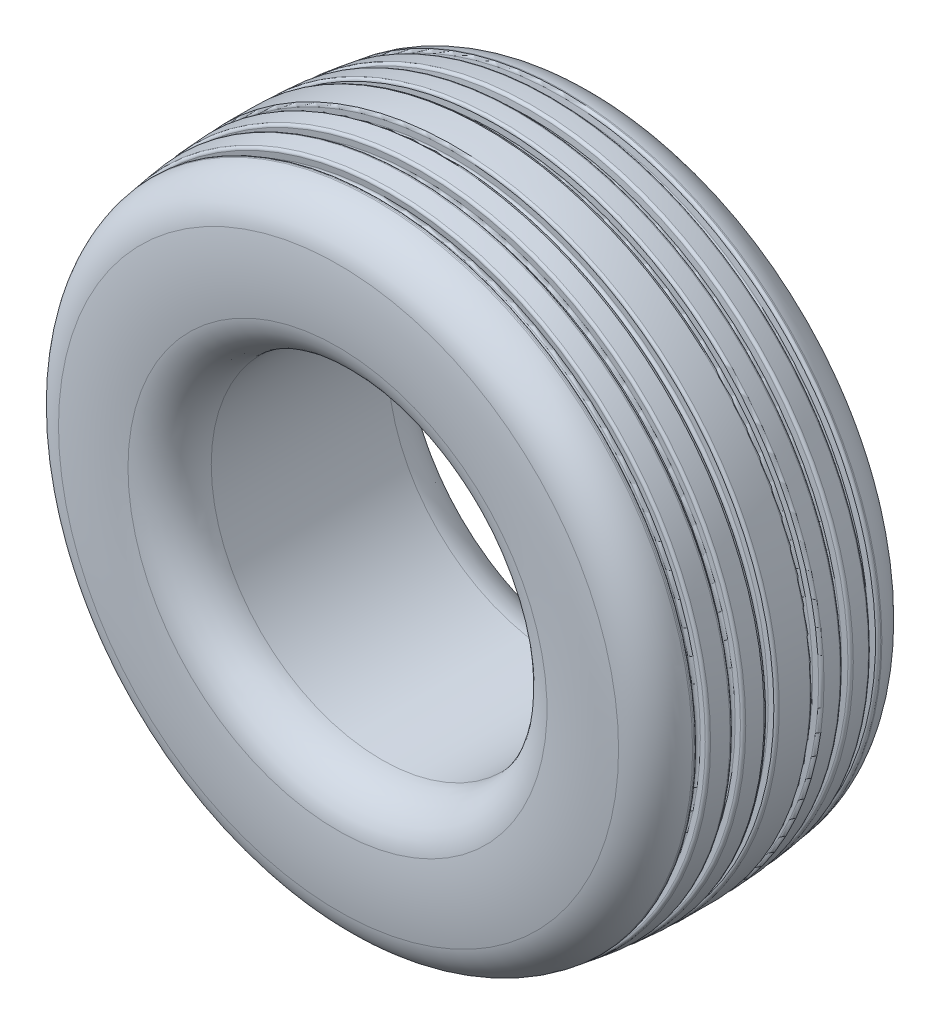
ISO-10303-21;
HEADER;
FILE_DESCRIPTION(('STEP AP214'),'2;1');
FILE_NAME('part.step','',(''),(''),'','','');
FILE_SCHEMA(('AUTOMOTIVE_DESIGN { 1 0 10303 214 1 1 1 1 }'));
ENDSEC;
DATA;
#1=APPLICATION_CONTEXT('core data for automotive mechanical design processes');
#2=APPLICATION_PROTOCOL_DEFINITION('international standard','automotive_design',2000,#1);
#3=PRODUCT_CONTEXT('',#1,'mechanical');
#4=PRODUCT('Part','Part','',(#3));
#5=PRODUCT_RELATED_PRODUCT_CATEGORY('part','',(#4));
#6=PRODUCT_DEFINITION_FORMATION('','',#4);
#7=PRODUCT_DEFINITION_CONTEXT('part definition',#1,'design');
#8=PRODUCT_DEFINITION('design','',#6,#7);
#9=PRODUCT_DEFINITION_SHAPE('','',#8);
#10=(LENGTH_UNIT() NAMED_UNIT(*) SI_UNIT(.MILLI.,.METRE.));
#11=(NAMED_UNIT(*) PLANE_ANGLE_UNIT() SI_UNIT($,.RADIAN.));
#12=(NAMED_UNIT(*) SI_UNIT($,.STERADIAN.) SOLID_ANGLE_UNIT());
#13=UNCERTAINTY_MEASURE_WITH_UNIT(LENGTH_MEASURE(1.E-05),#10,'distance_accuracy_value','');
#14=(GEOMETRIC_REPRESENTATION_CONTEXT(3) GLOBAL_UNCERTAINTY_ASSIGNED_CONTEXT((#13)) GLOBAL_UNIT_ASSIGNED_CONTEXT((#10,
#11,#12)) REPRESENTATION_CONTEXT('',''));
#15=CARTESIAN_POINT('',(0.,0.,0.));
#16=DIRECTION('',(0.,0.,1.));
#17=DIRECTION('',(1.,0.,0.));
#18=AXIS2_PLACEMENT_3D('',#15,#16,#17);
#19=CARTESIAN_POINT('',(0.,0.,-2.22044604925031E-13));
#20=DIRECTION('',(0.,0.,1.));
#21=DIRECTION('',(1.,0.,0.));
#22=AXIS2_PLACEMENT_3D('',#19,#20,#21);
#23=DEGENERATE_TOROIDAL_SURFACE('',#22,591.666666666668,1321.66666666667,.F.);
#24=CARTESIAN_POINT('',(0.,0.,-34.7462902611341));
#25=DIRECTION('',(0.,0.,1.));
#26=DIRECTION('',(1.,0.,0.));
#27=AXIS2_PLACEMENT_3D('',#24,#25,#26);
#28=CIRCLE('',#27,729.543185359447);
#29=CARTESIAN_POINT('',(729.543185359447,0.,-34.7462902611341));
#30=VERTEX_POINT('',#29);
#31=EDGE_CURVE('E139',#30,#30,#28,.T.);
#32=ORIENTED_EDGE('',*,*,#31,.T.);
#33=EDGE_LOOP('',(#32));
#34=FACE_BOUND('',#33,.T.);
#35=CARTESIAN_POINT('',(0.,0.,34.7462902611341));
#36=DIRECTION('',(0.,0.,-1.));
#37=DIRECTION('',(-1.,0.,0.));
#38=AXIS2_PLACEMENT_3D('',#35,#36,#37);
#39=CIRCLE('',#38,729.543185359447);
#40=CARTESIAN_POINT('',(-729.543185359447,0.,34.7462902611341));
#41=VERTEX_POINT('',#40);
#42=EDGE_CURVE('E205',#41,#41,#39,.T.);
#43=ORIENTED_EDGE('',*,*,#42,.T.);
#44=EDGE_LOOP('',(#43));
#45=FACE_BOUND('',#44,.T.);
#46=ADVANCED_FACE('F38',(#34,#45),#23,.F.);
#47=CARTESIAN_POINT('',(0.,0.,-212.651269505067));
#48=DIRECTION('',(0.,0.,1.));
#49=DIRECTION('',(1.,0.,0.));
#50=AXIS2_PLACEMENT_3D('',#47,#48,#49);
#51=CIRCLE('',#50,712.780425152569);
#52=CARTESIAN_POINT('',(712.780425152569,0.,-212.651269505067));
#53=VERTEX_POINT('',#52);
#54=EDGE_CURVE('E10',#53,#53,#51,.T.);
#55=ORIENTED_EDGE('',*,*,#54,.T.);
#56=EDGE_LOOP('',(#55));
#57=FACE_BOUND('',#56,.T.);
#58=CARTESIAN_POINT('',(0.,0.,-209.80915531276));
#59=DIRECTION('',(0.,0.,1.));
#60=DIRECTION('',(1.,0.,0.));
#61=AXIS2_PLACEMENT_3D('',#58,#59,#60);
#62=CIRCLE('',#61,713.24056993091);
#63=CARTESIAN_POINT('',(713.24056993091,0.,-209.80915531276));
#64=VERTEX_POINT('',#63);
#65=EDGE_CURVE('E70',#64,#64,#62,.F.);
#66=ORIENTED_EDGE('',*,*,#65,.T.);
#67=EDGE_LOOP('',(#66));
#68=FACE_BOUND('',#67,.T.);
#69=ADVANCED_FACE('F255',(#57,#68),#23,.F.);
#70=CARTESIAN_POINT('',(0.,0.,212.651269505067));
#71=DIRECTION('',(0.,0.,-1.));
#72=DIRECTION('',(-1.,0.,0.));
#73=AXIS2_PLACEMENT_3D('',#70,#71,#72);
#74=CIRCLE('',#73,712.780425152569);
#75=CARTESIAN_POINT('',(-712.780425152569,0.,212.651269505067));
#76=VERTEX_POINT('',#75);
#77=EDGE_CURVE('E61',#76,#76,#74,.T.);
#78=ORIENTED_EDGE('',*,*,#77,.T.);
#79=EDGE_LOOP('',(#78));
#80=FACE_BOUND('',#79,.T.);
#81=CARTESIAN_POINT('',(0.,0.,209.809155312761));
#82=DIRECTION('',(0.,0.,-1.));
#83=DIRECTION('',(-1.,0.,0.));
#84=AXIS2_PLACEMENT_3D('',#81,#82,#83);
#85=CIRCLE('',#84,713.24056993091);
#86=CARTESIAN_POINT('',(-713.24056993091,0.,209.809155312761));
#87=VERTEX_POINT('',#86);
#88=EDGE_CURVE('E142',#87,#87,#85,.F.);
#89=ORIENTED_EDGE('',*,*,#88,.T.);
#90=EDGE_LOOP('',(#89));
#91=FACE_BOUND('',#90,.T.);
#92=ADVANCED_FACE('F302',(#80,#91),#23,.F.);
#93=CARTESIAN_POINT('',(0.,0.,-277.914186143353));
#94=DIRECTION('',(0.,0.,1.));
#95=DIRECTION('',(1.,0.,0.));
#96=AXIS2_PLACEMENT_3D('',#93,#94,#95);
#97=DEGENERATE_TOROIDAL_SURFACE('',#96,541.47,580.,.T.);
#98=CARTESIAN_POINT('',(0.,0.,295.410770488003));
#99=DIRECTION('',(0.,0.,-1.));
#100=DIRECTION('',(-1.,0.,0.));
#101=AXIS2_PLACEMENT_3D('',#98,#99,#100);
#102=CIRCLE('',#101,629.211062813586);
#103=CARTESIAN_POINT('',(-629.211062813586,0.,295.410770488003));
#104=VERTEX_POINT('',#103);
#105=EDGE_CURVE('E64',#104,#104,#102,.F.);
#106=ORIENTED_EDGE('',*,*,#105,.T.);
#107=EDGE_LOOP('',(#106));
#108=FACE_BOUND('',#107,.T.);
#109=CARTESIAN_POINT('',(0.,0.,297.757726655887));
#110=DIRECTION('',(0.,0.,-1.));
#111=DIRECTION('',(-1.,0.,0.));
#112=AXIS2_PLACEMENT_3D('',#109,#110,#111);
#113=CIRCLE('',#112,470.74625);
#114=CARTESIAN_POINT('',(-470.74625,0.,297.757726655887));
#115=VERTEX_POINT('',#114);
#116=EDGE_CURVE('E67',#115,#115,#113,.T.);
#117=ORIENTED_EDGE('',*,*,#116,.T.);
#118=EDGE_LOOP('',(#117));
#119=FACE_BOUND('',#118,.T.);
#120=ADVANCED_FACE('F348',(#108,#119),#97,.T.);
#121=CARTESIAN_POINT('',(0.,0.,600.));
#122=DIRECTION('',(0.,0.,1.));
#123=DIRECTION('',(1.,0.,0.));
#124=AXIS2_PLACEMENT_3D('',#121,#122,#123);
#125=CYLINDRICAL_SURFACE('',#124,382.94);
#126=CARTESIAN_POINT('',(0.,0.,198.503948587054));
#127=DIRECTION('',(0.,0.,-1.));
#128=DIRECTION('',(-1.,0.,0.));
#129=AXIS2_PLACEMENT_3D('',#126,#127,#128);
#130=CIRCLE('',#129,382.94);
#131=CARTESIAN_POINT('',(-382.94,0.,198.503948587054));
#132=VERTEX_POINT('',#131);
#133=EDGE_CURVE('E53',#132,#132,#130,.F.);
#134=ORIENTED_EDGE('',*,*,#133,.T.);
#135=EDGE_LOOP('',(#134));
#136=FACE_BOUND('',#135,.T.);
#137=CARTESIAN_POINT('',(0.,0.,-198.503948587054));
#138=DIRECTION('',(0.,0.,-1.));
#139=DIRECTION('',(-1.,0.,0.));
#140=AXIS2_PLACEMENT_3D('',#137,#138,#139);
#141=CIRCLE('',#140,382.94);
#142=CARTESIAN_POINT('',(-382.94,0.,-198.503948587054));
#143=VERTEX_POINT('',#142);
#144=EDGE_CURVE('E58',#143,#143,#141,.T.);
#145=ORIENTED_EDGE('',*,*,#144,.T.);
#146=EDGE_LOOP('',(#145));
#147=FACE_BOUND('',#146,.T.);
#148=ADVANCED_FACE('F354',(#136,#147),#125,.F.);
#149=CARTESIAN_POINT('',(0.,0.,277.914186143353));
#150=DIRECTION('',(0.,0.,1.));
#151=DIRECTION('',(1.,0.,0.));
#152=AXIS2_PLACEMENT_3D('',#149,#150,#151);
#153=DEGENERATE_TOROIDAL_SURFACE('',#152,541.47,580.,.T.);
#154=CARTESIAN_POINT('',(0.,0.,-297.757726655887));
#155=DIRECTION('',(0.,0.,1.));
#156=DIRECTION('',(1.,0.,0.));
#157=AXIS2_PLACEMENT_3D('',#154,#155,#156);
#158=CIRCLE('',#157,470.74625);
#159=CARTESIAN_POINT('',(470.74625,0.,-297.757726655887));
#160=VERTEX_POINT('',#159);
#161=EDGE_CURVE('E45',#160,#160,#158,.T.);
#162=ORIENTED_EDGE('',*,*,#161,.T.);
#163=EDGE_LOOP('',(#162));
#164=FACE_BOUND('',#163,.T.);
#165=CARTESIAN_POINT('',(0.,0.,-295.410770488002));
#166=DIRECTION('',(0.,0.,1.));
#167=DIRECTION('',(1.,0.,0.));
#168=AXIS2_PLACEMENT_3D('',#165,#166,#167);
#169=CIRCLE('',#168,629.211062813586);
#170=CARTESIAN_POINT('',(629.211062813586,0.,-295.410770488002));
#171=VERTEX_POINT('',#170);
#172=EDGE_CURVE('E49',#171,#171,#169,.F.);
#173=ORIENTED_EDGE('',*,*,#172,.T.);
#174=EDGE_LOOP('',(#173));
#175=FACE_BOUND('',#174,.T.);
#176=ADVANCED_FACE('F326',(#164,#175),#153,.T.);
#177=CARTESIAN_POINT('',(0.,0.,-2.22044604925031E-13));
#178=DIRECTION('',(0.,0.,1.));
#179=DIRECTION('',(1.,0.,0.));
#180=AXIS2_PLACEMENT_3D('',#177,#178,#179);
#181=DEGENERATE_TOROIDAL_SURFACE('',#180,591.666666666668,1296.66666666667,.F.);
#182=CARTESIAN_POINT('',(0.,0.,185.912630517313));
#183=DIRECTION('',(0.,0.,-1.));
#184=DIRECTION('',(-1.,0.,0.));
#185=AXIS2_PLACEMENT_3D('',#182,#183,#184);
#186=CIRCLE('',#185,691.602961376707);
#187=CARTESIAN_POINT('',(-691.602961376707,0.,185.912630517313));
#188=VERTEX_POINT('',#187);
#189=EDGE_CURVE('E151',#188,#188,#186,.F.);
#190=ORIENTED_EDGE('',*,*,#189,.T.);
#191=EDGE_LOOP('',(#190));
#192=FACE_BOUND('',#191,.T.);
#193=CARTESIAN_POINT('',(0.,0.,194.09698450321));
#194=DIRECTION('',(0.,0.,-1.));
#195=DIRECTION('',(-1.,0.,0.));
#196=AXIS2_PLACEMENT_3D('',#193,#194,#195);
#197=CIRCLE('',#196,690.390588315031);
#198=CARTESIAN_POINT('',(-690.390588315031,0.,194.09698450321));
#199=VERTEX_POINT('',#198);
#200=EDGE_CURVE('E154',#199,#199,#197,.T.);
#201=ORIENTED_EDGE('',*,*,#200,.T.);
#202=EDGE_LOOP('',(#201));
#203=FACE_BOUND('',#202,.T.);
#204=ADVANCED_FACE('F314',(#192,#203),#181,.F.);
#205=CARTESIAN_POINT('',(0.,0.,180.));
#206=DIRECTION('',(0.,0.,1.));
#207=DIRECTION('',(1.,0.,0.));
#208=AXIS2_PLACEMENT_3D('',#205,#206,#207);
#209=CONICAL_SURFACE('',#208,692.445651023824,1.43152909270516);
#210=CARTESIAN_POINT('',(0.,0.,182.635632923406));
#211=DIRECTION('',(0.,0.,1.));
#212=DIRECTION('',(1.,0.,0.));
#213=AXIS2_PLACEMENT_3D('',#210,#211,#212);
#214=CIRCLE('',#213,711.248143811917);
#215=CARTESIAN_POINT('',(711.248143811917,0.,182.635632923406));
#216=VERTEX_POINT('',#215);
#217=EDGE_CURVE('E157',#216,#216,#214,.T.);
#218=ORIENTED_EDGE('',*,*,#217,.T.);
#219=EDGE_LOOP('',(#218));
#220=FACE_BOUND('',#219,.T.);
#221=CARTESIAN_POINT('',(0.,0.,180.830986720625));
#222=DIRECTION('',(0.,0.,1.));
#223=DIRECTION('',(1.,0.,0.));
#224=AXIS2_PLACEMENT_3D('',#221,#222,#223);
#225=CIRCLE('',#224,698.373874822666);
#226=CARTESIAN_POINT('',(698.373874822666,0.,180.830986720625));
#227=VERTEX_POINT('',#226);
#228=EDGE_CURVE('E160',#227,#227,#225,.F.);
#229=ORIENTED_EDGE('',*,*,#228,.T.);
#230=EDGE_LOOP('',(#229));
#231=FACE_BOUND('',#230,.T.);
#232=ADVANCED_FACE('F311',(#220,#231),#209,.F.);
#233=CARTESIAN_POINT('',(0.,0.,203.856041131105));
#234=DIRECTION('',(0.,0.,1.));
#235=DIRECTION('',(1.,0.,0.));
#236=AXIS2_PLACEMENT_3D('',#233,#234,#235);
#237=CONICAL_SURFACE('',#236,714.183819519302,1.41593645930072);
#238=CARTESIAN_POINT('',(0.,0.,200.923318578472));
#239=DIRECTION('',(0.,0.,1.));
#240=DIRECTION('',(1.,0.,0.));
#241=AXIS2_PLACEMENT_3D('',#238,#239,#240);
#242=CIRCLE('',#241,695.397537052735);
#243=CARTESIAN_POINT('',(695.397537052735,0.,200.923318578472));
#244=VERTEX_POINT('',#243);
#245=EDGE_CURVE('E145',#244,#244,#242,.T.);
#246=ORIENTED_EDGE('',*,*,#245,.T.);
#247=EDGE_LOOP('',(#246));
#248=FACE_BOUND('',#247,.T.);
#249=CARTESIAN_POINT('',(0.,0.,202.928481026007));
#250=DIRECTION('',(0.,0.,1.));
#251=DIRECTION('',(1.,0.,0.));
#252=AXIS2_PLACEMENT_3D('',#249,#250,#251);
#253=CIRCLE('',#252,708.242102965362);
#254=CARTESIAN_POINT('',(708.242102965362,0.,202.928481026007));
#255=VERTEX_POINT('',#254);
#256=EDGE_CURVE('E148',#255,#255,#253,.F.);
#257=ORIENTED_EDGE('',*,*,#256,.T.);
#258=EDGE_LOOP('',(#257));
#259=FACE_BOUND('',#258,.T.);
#260=ADVANCED_FACE('F301',(#248,#259),#237,.T.);
#261=CARTESIAN_POINT('',(0.,0.,138.502042920171));
#262=DIRECTION('',(0.,0.,-1.));
#263=DIRECTION('',(-1.,0.,0.));
#264=AXIS2_PLACEMENT_3D('',#261,#262,#263);
#265=CIRCLE('',#264,722.722911002267);
#266=CARTESIAN_POINT('',(-722.722911002267,0.,138.502042920171));
#267=VERTEX_POINT('',#266);
#268=EDGE_CURVE('E163',#267,#267,#265,.F.);
#269=ORIENTED_EDGE('',*,*,#268,.T.);
#270=EDGE_LOOP('',(#269));
#271=FACE_BOUND('',#270,.T.);
#272=CARTESIAN_POINT('',(0.,0.,177.499523620628));
#273=DIRECTION('',(0.,0.,-1.));
#274=DIRECTION('',(-1.,0.,0.));
#275=AXIS2_PLACEMENT_3D('',#272,#273,#274);
#276=CIRCLE('',#275,718.026693205112);
#277=CARTESIAN_POINT('',(-718.026693205112,0.,177.499523620628));
#278=VERTEX_POINT('',#277);
#279=EDGE_CURVE('E166',#278,#278,#276,.T.);
#280=ORIENTED_EDGE('',*,*,#279,.T.);
#281=EDGE_LOOP('',(#280));
#282=FACE_BOUND('',#281,.T.);
#283=ADVANCED_FACE('F254',(#271,#282),#23,.F.);
#284=CARTESIAN_POINT('',(0.,0.,-2.22044604925031E-13));
#285=DIRECTION('',(0.,0.,1.));
#286=DIRECTION('',(1.,0.,0.));
#287=AXIS2_PLACEMENT_3D('',#284,#285,#286);
#288=DEGENERATE_TOROIDAL_SURFACE('',#287,591.666666666668,1296.66666666667,.F.);
#289=CARTESIAN_POINT('',(0.,0.,115.949668340668));
#290=DIRECTION('',(0.,0.,-1.));
#291=DIRECTION('',(-1.,0.,0.));
#292=AXIS2_PLACEMENT_3D('',#289,#290,#291);
#293=CIRCLE('',#292,699.805407695041);
#294=CARTESIAN_POINT('',(-699.805407695041,0.,115.949668340668));
#295=VERTEX_POINT('',#294);
#296=EDGE_CURVE('E175',#295,#295,#293,.F.);
#297=ORIENTED_EDGE('',*,*,#296,.T.);
#298=EDGE_LOOP('',(#297));
#299=FACE_BOUND('',#298,.T.);
#300=CARTESIAN_POINT('',(0.,0.,124.056348016691));
#301=DIRECTION('',(0.,0.,-1.));
#302=DIRECTION('',(-1.,0.,0.));
#303=AXIS2_PLACEMENT_3D('',#300,#301,#302);
#304=CIRCLE('',#303,699.051918835691);
#305=CARTESIAN_POINT('',(-699.051918835691,0.,124.056348016691));
#306=VERTEX_POINT('',#305);
#307=EDGE_CURVE('E178',#306,#306,#304,.T.);
#308=ORIENTED_EDGE('',*,*,#307,.T.);
#309=EDGE_LOOP('',(#308));
#310=FACE_BOUND('',#309,.T.);
#311=ADVANCED_FACE('F267',(#299,#310),#288,.F.);
#312=CARTESIAN_POINT('',(0.,0.,110.));
#313=DIRECTION('',(0.,0.,1.));
#314=DIRECTION('',(1.,0.,0.));
#315=AXIS2_PLACEMENT_3D('',#312,#313,#314);
#316=CONICAL_SURFACE('',#315,700.325765371712,1.48586133924975);
#317=CARTESIAN_POINT('',(0.,0.,111.610664564305));
#318=DIRECTION('',(0.,0.,1.));
#319=DIRECTION('',(1.,0.,0.));
#320=AXIS2_PLACEMENT_3D('',#317,#318,#319);
#321=CIRCLE('',#320,719.243641986558);
#322=CARTESIAN_POINT('',(719.243641986558,0.,111.610664564305));
#323=VERTEX_POINT('',#322);
#324=EDGE_CURVE('E181',#323,#323,#321,.T.);
#325=ORIENTED_EDGE('',*,*,#324,.T.);
#326=EDGE_LOOP('',(#325));
#327=FACE_BOUND('',#326,.T.);
#328=CARTESIAN_POINT('',(0.,0.,110.507825218159));
#329=DIRECTION('',(0.,0.,1.));
#330=DIRECTION('',(1.,0.,0.));
#331=AXIS2_PLACEMENT_3D('',#328,#329,#330);
#332=CIRCLE('',#331,706.290368450443);
#333=CARTESIAN_POINT('',(706.290368450443,0.,110.507825218159));
#334=VERTEX_POINT('',#333);
#335=EDGE_CURVE('E184',#334,#334,#332,.F.);
#336=ORIENTED_EDGE('',*,*,#335,.T.);
#337=EDGE_LOOP('',(#336));
#338=FACE_BOUND('',#337,.T.);
#339=ADVANCED_FACE('F264',(#327,#338),#316,.F.);
#340=CARTESIAN_POINT('',(0.,0.,132.506426735218));
#341=DIRECTION('',(0.,0.,1.));
#342=DIRECTION('',(1.,0.,0.));
#343=AXIS2_PLACEMENT_3D('',#340,#341,#342);
#344=CONICAL_SURFACE('',#343,723.340871202087,1.47037053779902);
#345=CARTESIAN_POINT('',(0.,0.,130.600157076005));
#346=DIRECTION('',(0.,0.,1.));
#347=DIRECTION('',(1.,0.,0.));
#348=AXIS2_PLACEMENT_3D('',#345,#346,#347);
#349=CIRCLE('',#348,704.422853164493);
#350=CARTESIAN_POINT('',(704.422853164493,0.,130.600157076005));
#351=VERTEX_POINT('',#350);
#352=EDGE_CURVE('E169',#351,#351,#349,.T.);
#353=ORIENTED_EDGE('',*,*,#352,.T.);
#354=EDGE_LOOP('',(#353));
#355=FACE_BOUND('',#354,.T.);
#356=CARTESIAN_POINT('',(0.,0.,131.903512666903));
#357=DIRECTION('',(0.,0.,1.));
#358=DIRECTION('',(1.,0.,0.));
#359=AXIS2_PLACEMENT_3D('',#356,#357,#358);
#360=CIRCLE('',#359,717.357489383904);
#361=CARTESIAN_POINT('',(717.357489383904,0.,131.903512666903));
#362=VERTEX_POINT('',#361);
#363=EDGE_CURVE('E172',#362,#362,#360,.F.);
#364=ORIENTED_EDGE('',*,*,#363,.T.);
#365=EDGE_LOOP('',(#364));
#366=FACE_BOUND('',#365,.T.);
#367=ADVANCED_FACE('F252',(#355,#366),#344,.T.);
#368=CARTESIAN_POINT('',(0.,0.,67.1770827536918));
#369=DIRECTION('',(0.,0.,-1.));
#370=DIRECTION('',(-1.,0.,0.));
#371=AXIS2_PLACEMENT_3D('',#368,#369,#370);
#372=CIRCLE('',#371,728.291672573811);
#373=CARTESIAN_POINT('',(-728.291672573811,0.,67.1770827536918));
#374=VERTEX_POINT('',#373);
#375=EDGE_CURVE('E187',#374,#374,#372,.F.);
#376=ORIENTED_EDGE('',*,*,#375,.T.);
#377=EDGE_LOOP('',(#376));
#378=FACE_BOUND('',#377,.T.);
#379=CARTESIAN_POINT('',(0.,0.,106.11402163275));
#380=DIRECTION('',(0.,0.,-1.));
#381=DIRECTION('',(-1.,0.,0.));
#382=AXIS2_PLACEMENT_3D('',#379,#380,#381);
#383=CIRCLE('',#382,725.733269643754);
#384=CARTESIAN_POINT('',(-725.733269643754,0.,106.11402163275));
#385=VERTEX_POINT('',#384);
#386=EDGE_CURVE('E190',#385,#385,#383,.T.);
#387=ORIENTED_EDGE('',*,*,#386,.T.);
#388=EDGE_LOOP('',(#387));
#389=FACE_BOUND('',#388,.T.);
#390=ADVANCED_FACE('F228',(#378,#389),#23,.F.);
#391=CARTESIAN_POINT('',(0.,0.,-2.22044604925031E-13));
#392=DIRECTION('',(0.,0.,1.));
#393=DIRECTION('',(1.,0.,0.));
#394=AXIS2_PLACEMENT_3D('',#391,#392,#393);
#395=DEGENERATE_TOROIDAL_SURFACE('',#394,591.666666666668,1296.66666666667,.F.);
#396=CARTESIAN_POINT('',(0.,0.,45.969097700181));
#397=DIRECTION('',(0.,0.,-1.));
#398=DIRECTION('',(-1.,0.,0.));
#399=AXIS2_PLACEMENT_3D('',#396,#397,#398);
#400=CIRCLE('',#399,704.184901415525);
#401=CARTESIAN_POINT('',(-704.184901415525,0.,45.969097700181));
#402=VERTEX_POINT('',#401);
#403=EDGE_CURVE('E199',#402,#402,#400,.F.);
#404=ORIENTED_EDGE('',*,*,#403,.T.);
#405=EDGE_LOOP('',(#404));
#406=FACE_BOUND('',#405,.T.);
#407=CARTESIAN_POINT('',(0.,0.,54.0333964475978));
#408=DIRECTION('',(0.,0.,-1.));
#409=DIRECTION('',(-1.,0.,0.));
#410=AXIS2_PLACEMENT_3D('',#407,#408,#409);
#411=CIRCLE('',#410,703.873698012405);
#412=CARTESIAN_POINT('',(-703.873698012405,0.,54.0333964475978));
#413=VERTEX_POINT('',#412);
#414=EDGE_CURVE('E202',#413,#413,#411,.T.);
#415=ORIENTED_EDGE('',*,*,#414,.T.);
#416=EDGE_LOOP('',(#415));
#417=FACE_BOUND('',#416,.T.);
#418=ADVANCED_FACE('F225',(#406,#417),#395,.F.);
#419=CARTESIAN_POINT('',(0.,0.,40.));
#420=DIRECTION('',(0.,0.,1.));
#421=DIRECTION('',(1.,0.,0.));
#422=AXIS2_PLACEMENT_3D('',#419,#420,#421);
#423=CONICAL_SURFACE('',#422,704.3828865698,1.53994310300494);
#424=CARTESIAN_POINT('',(0.,0.,40.585696205202));
#425=DIRECTION('',(0.,0.,1.));
#426=DIRECTION('',(1.,0.,0.));
#427=AXIS2_PLACEMENT_3D('',#424,#425,#426);
#428=CIRCLE('',#427,723.36016919689);
#429=CARTESIAN_POINT('',(723.36016919689,0.,40.585696205202));
#430=VERTEX_POINT('',#429);
#431=EDGE_CURVE('E208',#430,#430,#428,.T.);
#432=ORIENTED_EDGE('',*,*,#431,.T.);
#433=EDGE_LOOP('',(#432));
#434=FACE_BOUND('',#433,.T.);
#435=CARTESIAN_POINT('',(0.,0.,40.1846637156957));
#436=DIRECTION('',(0.,0.,1.));
#437=DIRECTION('',(1.,0.,0.));
#438=AXIS2_PLACEMENT_3D('',#435,#436,#437);
#439=CIRCLE('',#438,710.366219725417);
#440=CARTESIAN_POINT('',(710.366219725417,0.,40.1846637156957));
#441=VERTEX_POINT('',#440);
#442=EDGE_CURVE('E211',#441,#441,#439,.F.);
#443=ORIENTED_EDGE('',*,*,#442,.T.);
#444=EDGE_LOOP('',(#443));
#445=FACE_BOUND('',#444,.T.);
#446=ADVANCED_FACE('F215',(#434,#445),#423,.F.);
#447=CARTESIAN_POINT('',(0.,0.,61.1568123393316));
#448=DIRECTION('',(0.,0.,1.));
#449=DIRECTION('',(1.,0.,0.));
#450=AXIS2_PLACEMENT_3D('',#447,#448,#449);
#451=CONICAL_SURFACE('',#450,728.584302688126,1.52450730461507);
#452=CARTESIAN_POINT('',(0.,0.,60.27699557354));
#453=DIRECTION('',(0.,0.,1.));
#454=DIRECTION('',(1.,0.,0.));
#455=AXIS2_PLACEMENT_3D('',#452,#453,#454);
#456=CIRCLE('',#455,709.590851370817);
#457=CARTESIAN_POINT('',(709.590851370817,0.,60.27699557354));
#458=VERTEX_POINT('',#457);
#459=EDGE_CURVE('E193',#458,#458,#456,.T.);
#460=ORIENTED_EDGE('',*,*,#459,.T.);
#461=EDGE_LOOP('',(#460));
#462=FACE_BOUND('',#461,.T.);
#463=CARTESIAN_POINT('',(0.,0.,60.878544307803));
#464=DIRECTION('',(0.,0.,1.));
#465=DIRECTION('',(1.,0.,0.));
#466=AXIS2_PLACEMENT_3D('',#463,#464,#465);
#467=CIRCLE('',#466,722.577062867829);
#468=CARTESIAN_POINT('',(722.577062867829,0.,60.878544307803));
#469=VERTEX_POINT('',#468);
#470=EDGE_CURVE('E196',#469,#469,#467,.F.);
#471=ORIENTED_EDGE('',*,*,#470,.T.);
#472=EDGE_LOOP('',(#471));
#473=FACE_BOUND('',#472,.T.);
#474=ADVANCED_FACE('F238',(#462,#473),#451,.T.);
#475=CARTESIAN_POINT('',(0.,0.,34.5885517429247));
#476=DIRECTION('',(0.,0.,-1.));
#477=DIRECTION('',(-1.,0.,0.));
#478=AXIS2_PLACEMENT_3D('',#475,#476,#477);
#479=TOROIDAL_SURFACE('',#478,723.545259171183,6.);
#480=ORIENTED_EDGE('',*,*,#42,.F.);
#481=EDGE_LOOP('',(#480));
#482=FACE_BOUND('',#481,.T.);
#483=ORIENTED_EDGE('',*,*,#431,.F.);
#484=EDGE_LOOP('',(#483));
#485=FACE_BOUND('',#484,.T.);
#486=ADVANCED_FACE('F221',(#482,#485),#479,.T.);
#487=CARTESIAN_POINT('',(0.,0.,46.1818081779711));
#488=DIRECTION('',(0.,0.,1.));
#489=DIRECTION('',(1.,0.,0.));
#490=AXIS2_PLACEMENT_3D('',#487,#488,#489);
#491=TOROIDAL_SURFACE('',#490,710.181129751124,6.);
#492=ORIENTED_EDGE('',*,*,#442,.F.);
#493=EDGE_LOOP('',(#492));
#494=FACE_BOUND('',#493,.T.);
#495=ORIENTED_EDGE('',*,*,#403,.F.);
#496=EDGE_LOOP('',(#495));
#497=FACE_BOUND('',#496,.T.);
#498=ADVANCED_FACE('F217',(#494,#497),#491,.F.);
#499=CARTESIAN_POINT('',(0.,0.,54.2834224465841));
#500=DIRECTION('',(0.,0.,1.));
#501=DIRECTION('',(1.,0.,0.));
#502=AXIS2_PLACEMENT_3D('',#499,#500,#501);
#503=TOROIDAL_SURFACE('',#502,709.868486332256,6.);
#504=ORIENTED_EDGE('',*,*,#414,.F.);
#505=EDGE_LOOP('',(#504));
#506=FACE_BOUND('',#505,.T.);
#507=ORIENTED_EDGE('',*,*,#459,.F.);
#508=EDGE_LOOP('',(#507));
#509=FACE_BOUND('',#508,.T.);
#510=ADVANCED_FACE('F220',(#506,#509),#503,.F.);
#511=CARTESIAN_POINT('',(0.,0.,66.8721174347595));
#512=DIRECTION('',(0.,0.,-1.));
#513=DIRECTION('',(-1.,0.,0.));
#514=AXIS2_PLACEMENT_3D('',#511,#512,#513);
#515=TOROIDAL_SURFACE('',#514,722.299427906389,6.);
#516=ORIENTED_EDGE('',*,*,#470,.F.);
#517=EDGE_LOOP('',(#516));
#518=FACE_BOUND('',#517,.T.);
#519=ORIENTED_EDGE('',*,*,#375,.F.);
#520=EDGE_LOOP('',(#519));
#521=FACE_BOUND('',#520,.T.);
#522=ADVANCED_FACE('F234',(#518,#521),#515,.T.);
#523=CARTESIAN_POINT('',(0.,0.,105.632293413484));
#524=DIRECTION('',(0.,0.,-1.));
#525=DIRECTION('',(-1.,0.,0.));
#526=AXIS2_PLACEMENT_3D('',#523,#524,#525);
#527=TOROIDAL_SURFACE('',#526,719.752639415864,6.);
#528=ORIENTED_EDGE('',*,*,#386,.F.);
#529=EDGE_LOOP('',(#528));
#530=FACE_BOUND('',#529,.T.);
#531=ORIENTED_EDGE('',*,*,#324,.F.);
#532=EDGE_LOOP('',(#531));
#533=FACE_BOUND('',#532,.T.);
#534=ADVANCED_FACE('F246',(#530,#533),#527,.T.);
#535=CARTESIAN_POINT('',(0.,0.,116.48619636898));
#536=DIRECTION('',(0.,0.,1.));
#537=DIRECTION('',(1.,0.,0.));
#538=AXIS2_PLACEMENT_3D('',#535,#536,#537);
#539=TOROIDAL_SURFACE('',#538,705.781371021137,6.);
#540=ORIENTED_EDGE('',*,*,#335,.F.);
#541=EDGE_LOOP('',(#540));
#542=FACE_BOUND('',#541,.T.);
#543=ORIENTED_EDGE('',*,*,#296,.F.);
#544=EDGE_LOOP('',(#543));
#545=FACE_BOUND('',#544,.T.);
#546=ADVANCED_FACE('F260',(#542,#545),#539,.F.);
#547=CARTESIAN_POINT('',(0.,0.,124.630387673324));
#548=DIRECTION('',(0.,0.,1.));
#549=DIRECTION('',(1.,0.,0.));
#550=AXIS2_PLACEMENT_3D('',#547,#548,#549);
#551=TOROIDAL_SURFACE('',#550,705.024395580946,6.);
#552=ORIENTED_EDGE('',*,*,#307,.F.);
#553=EDGE_LOOP('',(#552));
#554=FACE_BOUND('',#553,.T.);
#555=ORIENTED_EDGE('',*,*,#352,.F.);
#556=EDGE_LOOP('',(#555));
#557=FACE_BOUND('',#556,.T.);
#558=ADVANCED_FACE('F273',(#554,#557),#551,.F.);
#559=CARTESIAN_POINT('',(0.,0.,137.873282069587));
#560=DIRECTION('',(0.,0.,-1.));
#561=DIRECTION('',(-1.,0.,0.));
#562=AXIS2_PLACEMENT_3D('',#559,#560,#561);
#563=TOROIDAL_SURFACE('',#562,716.755946967452,6.);
#564=ORIENTED_EDGE('',*,*,#363,.F.);
#565=EDGE_LOOP('',(#564));
#566=FACE_BOUND('',#565,.T.);
#567=ORIENTED_EDGE('',*,*,#268,.F.);
#568=EDGE_LOOP('',(#567));
#569=FACE_BOUND('',#568,.T.);
#570=ADVANCED_FACE('F284',(#566,#569),#563,.T.);
#571=CARTESIAN_POINT('',(0.,0.,176.693725026638));
#572=DIRECTION('',(0.,0.,-1.));
#573=DIRECTION('',(-1.,0.,0.));
#574=AXIS2_PLACEMENT_3D('',#571,#572,#573);
#575=TOROIDAL_SURFACE('',#574,712.081048696236,6.);
#576=ORIENTED_EDGE('',*,*,#279,.F.);
#577=EDGE_LOOP('',(#576));
#578=FACE_BOUND('',#577,.T.);
#579=ORIENTED_EDGE('',*,*,#217,.F.);
#580=EDGE_LOOP('',(#579));
#581=FACE_BOUND('',#580,.T.);
#582=ADVANCED_FACE('F295',(#578,#581),#575,.T.);
#583=CARTESIAN_POINT('',(0.,0.,186.772894617393));
#584=DIRECTION('',(0.,0.,1.));
#585=DIRECTION('',(1.,0.,0.));
#586=AXIS2_PLACEMENT_3D('',#583,#584,#585);
#587=TOROIDAL_SURFACE('',#586,697.540969938347,6.);
#588=ORIENTED_EDGE('',*,*,#228,.F.);
#589=EDGE_LOOP('',(#588));
#590=FACE_BOUND('',#589,.T.);
#591=ORIENTED_EDGE('',*,*,#189,.F.);
#592=EDGE_LOOP('',(#591));
#593=FACE_BOUND('',#592,.T.);
#594=ADVANCED_FACE('F307',(#590,#593),#587,.F.);
#595=CARTESIAN_POINT('',(0.,0.,194.995119650011));
#596=DIRECTION('',(0.,0.,1.));
#597=DIRECTION('',(1.,0.,0.));
#598=AXIS2_PLACEMENT_3D('',#595,#596,#597);
#599=TOROIDAL_SURFACE('',#598,696.322986924201,6.);
#600=ORIENTED_EDGE('',*,*,#200,.F.);
#601=EDGE_LOOP('',(#600));
#602=FACE_BOUND('',#601,.T.);
#603=ORIENTED_EDGE('',*,*,#245,.F.);
#604=EDGE_LOOP('',(#603));
#605=FACE_BOUND('',#604,.T.);
#606=ADVANCED_FACE('F320',(#602,#605),#599,.F.);
#607=CARTESIAN_POINT('',(0.,0.,208.856679954468));
#608=DIRECTION('',(0.,0.,-1.));
#609=DIRECTION('',(-1.,0.,0.));
#610=AXIS2_PLACEMENT_3D('',#607,#608,#609);
#611=TOROIDAL_SURFACE('',#610,707.316653093897,6.);
#612=ORIENTED_EDGE('',*,*,#256,.F.);
#613=EDGE_LOOP('',(#612));
#614=FACE_BOUND('',#613,.T.);
#615=ORIENTED_EDGE('',*,*,#88,.F.);
#616=EDGE_LOOP('',(#615));
#617=FACE_BOUND('',#616,.T.);
#618=ADVANCED_FACE('F332',(#614,#617),#611,.T.);
#619=CARTESIAN_POINT('',(0.,0.,2.22044604925031E-13));
#620=DIRECTION('',(0.,0.,-1.));
#621=DIRECTION('',(1.,0.,0.));
#622=AXIS2_PLACEMENT_3D('',#619,#620,#621);
#623=DEGENERATE_TOROIDAL_SURFACE('',#622,591.666666666668,1296.66666666667,.F.);
#624=CARTESIAN_POINT('',(0.,0.,-185.912630517313));
#625=DIRECTION('',(0.,0.,1.));
#626=DIRECTION('',(1.,0.,0.));
#627=AXIS2_PLACEMENT_3D('',#624,#625,#626);
#628=CIRCLE('',#627,691.602961376707);
#629=CARTESIAN_POINT('',(691.602961376707,0.,-185.912630517313));
#630=VERTEX_POINT('',#629);
#631=EDGE_CURVE('E79',#630,#630,#628,.F.);
#632=ORIENTED_EDGE('',*,*,#631,.T.);
#633=EDGE_LOOP('',(#632));
#634=FACE_BOUND('',#633,.T.);
#635=CARTESIAN_POINT('',(0.,0.,-194.09698450321));
#636=DIRECTION('',(0.,0.,1.));
#637=DIRECTION('',(1.,0.,0.));
#638=AXIS2_PLACEMENT_3D('',#635,#636,#637);
#639=CIRCLE('',#638,690.390588315031);
#640=CARTESIAN_POINT('',(690.390588315031,0.,-194.09698450321));
#641=VERTEX_POINT('',#640);
#642=EDGE_CURVE('E82',#641,#641,#639,.T.);
#643=ORIENTED_EDGE('',*,*,#642,.T.);
#644=EDGE_LOOP('',(#643));
#645=FACE_BOUND('',#644,.T.);
#646=ADVANCED_FACE('F343',(#634,#645),#623,.F.);
#647=CARTESIAN_POINT('',(0.,0.,-180.));
#648=DIRECTION('',(0.,0.,-1.));
#649=DIRECTION('',(1.,0.,0.));
#650=AXIS2_PLACEMENT_3D('',#647,#648,#649);
#651=CONICAL_SURFACE('',#650,692.445651023824,1.43152909270516);
#652=CARTESIAN_POINT('',(0.,0.,-182.635632923406));
#653=DIRECTION('',(0.,0.,-1.));
#654=DIRECTION('',(-1.,0.,0.));
#655=AXIS2_PLACEMENT_3D('',#652,#653,#654);
#656=CIRCLE('',#655,711.248143811917);
#657=CARTESIAN_POINT('',(-711.248143811917,0.,-182.635632923406));
#658=VERTEX_POINT('',#657);
#659=EDGE_CURVE('E85',#658,#658,#656,.T.);
#660=ORIENTED_EDGE('',*,*,#659,.T.);
#661=EDGE_LOOP('',(#660));
#662=FACE_BOUND('',#661,.T.);
#663=CARTESIAN_POINT('',(0.,0.,-180.830986720625));
#664=DIRECTION('',(0.,0.,-1.));
#665=DIRECTION('',(-1.,0.,0.));
#666=AXIS2_PLACEMENT_3D('',#663,#664,#665);
#667=CIRCLE('',#666,698.373874822666);
#668=CARTESIAN_POINT('',(-698.373874822666,0.,-180.830986720625));
#669=VERTEX_POINT('',#668);
#670=EDGE_CURVE('E88',#669,#669,#667,.F.);
#671=ORIENTED_EDGE('',*,*,#670,.T.);
#672=EDGE_LOOP('',(#671));
#673=FACE_BOUND('',#672,.T.);
#674=ADVANCED_FACE('F396',(#662,#673),#651,.F.);
#675=CARTESIAN_POINT('',(0.,0.,-203.856041131105));
#676=DIRECTION('',(0.,0.,-1.));
#677=DIRECTION('',(1.,0.,0.));
#678=AXIS2_PLACEMENT_3D('',#675,#676,#677);
#679=CONICAL_SURFACE('',#678,714.183819519302,1.41593645930072);
#680=CARTESIAN_POINT('',(0.,0.,-200.923318578472));
#681=DIRECTION('',(0.,0.,-1.));
#682=DIRECTION('',(-1.,0.,0.));
#683=AXIS2_PLACEMENT_3D('',#680,#681,#682);
#684=CIRCLE('',#683,695.397537052735);
#685=CARTESIAN_POINT('',(-695.397537052735,0.,-200.923318578472));
#686=VERTEX_POINT('',#685);
#687=EDGE_CURVE('E73',#686,#686,#684,.T.);
#688=ORIENTED_EDGE('',*,*,#687,.T.);
#689=EDGE_LOOP('',(#688));
#690=FACE_BOUND('',#689,.T.);
#691=CARTESIAN_POINT('',(0.,0.,-202.928481026007));
#692=DIRECTION('',(0.,0.,-1.));
#693=DIRECTION('',(-1.,0.,0.));
#694=AXIS2_PLACEMENT_3D('',#691,#692,#693);
#695=CIRCLE('',#694,708.242102965362);
#696=CARTESIAN_POINT('',(-708.242102965362,0.,-202.928481026007));
#697=VERTEX_POINT('',#696);
#698=EDGE_CURVE('E76',#697,#697,#695,.F.);
#699=ORIENTED_EDGE('',*,*,#698,.T.);
#700=EDGE_LOOP('',(#699));
#701=FACE_BOUND('',#700,.T.);
#702=ADVANCED_FACE('F386',(#690,#701),#679,.T.);
#703=CARTESIAN_POINT('',(0.,0.,-138.502042920171));
#704=DIRECTION('',(0.,0.,1.));
#705=DIRECTION('',(1.,0.,0.));
#706=AXIS2_PLACEMENT_3D('',#703,#704,#705);
#707=CIRCLE('',#706,722.722911002267);
#708=CARTESIAN_POINT('',(722.722911002267,0.,-138.502042920171));
#709=VERTEX_POINT('',#708);
#710=EDGE_CURVE('E91',#709,#709,#707,.F.);
#711=ORIENTED_EDGE('',*,*,#710,.T.);
#712=EDGE_LOOP('',(#711));
#713=FACE_BOUND('',#712,.T.);
#714=CARTESIAN_POINT('',(0.,0.,-177.499523620628));
#715=DIRECTION('',(0.,0.,1.));
#716=DIRECTION('',(1.,0.,0.));
#717=AXIS2_PLACEMENT_3D('',#714,#715,#716);
#718=CIRCLE('',#717,718.026693205112);
#719=CARTESIAN_POINT('',(718.026693205112,0.,-177.499523620628));
#720=VERTEX_POINT('',#719);
#721=EDGE_CURVE('E94',#720,#720,#718,.T.);
#722=ORIENTED_EDGE('',*,*,#721,.T.);
#723=EDGE_LOOP('',(#722));
#724=FACE_BOUND('',#723,.T.);
#725=ADVANCED_FACE('F357',(#713,#724),#23,.F.);
#726=CARTESIAN_POINT('',(0.,0.,2.22044604925031E-13));
#727=DIRECTION('',(0.,0.,-1.));
#728=DIRECTION('',(1.,0.,0.));
#729=AXIS2_PLACEMENT_3D('',#726,#727,#728);
#730=DEGENERATE_TOROIDAL_SURFACE('',#729,591.666666666668,1296.66666666667,.F.);
#731=CARTESIAN_POINT('',(0.,0.,-115.949668340668));
#732=DIRECTION('',(0.,0.,1.));
#733=DIRECTION('',(1.,0.,0.));
#734=AXIS2_PLACEMENT_3D('',#731,#732,#733);
#735=CIRCLE('',#734,699.805407695041);
#736=CARTESIAN_POINT('',(699.805407695041,0.,-115.949668340668));
#737=VERTEX_POINT('',#736);
#738=EDGE_CURVE('E103',#737,#737,#735,.F.);
#739=ORIENTED_EDGE('',*,*,#738,.T.);
#740=EDGE_LOOP('',(#739));
#741=FACE_BOUND('',#740,.T.);
#742=CARTESIAN_POINT('',(0.,0.,-124.056348016691));
#743=DIRECTION('',(0.,0.,1.));
#744=DIRECTION('',(1.,0.,0.));
#745=AXIS2_PLACEMENT_3D('',#742,#743,#744);
#746=CIRCLE('',#745,699.051918835691);
#747=CARTESIAN_POINT('',(699.051918835691,0.,-124.056348016691));
#748=VERTEX_POINT('',#747);
#749=EDGE_CURVE('E106',#748,#748,#746,.T.);
#750=ORIENTED_EDGE('',*,*,#749,.T.);
#751=EDGE_LOOP('',(#750));
#752=FACE_BOUND('',#751,.T.);
#753=ADVANCED_FACE('F385',(#741,#752),#730,.F.);
#754=CARTESIAN_POINT('',(0.,0.,-110.));
#755=DIRECTION('',(0.,0.,-1.));
#756=DIRECTION('',(1.,0.,0.));
#757=AXIS2_PLACEMENT_3D('',#754,#755,#756);
#758=CONICAL_SURFACE('',#757,700.325765371712,1.48586133924975);
#759=CARTESIAN_POINT('',(0.,0.,-111.610664564305));
#760=DIRECTION('',(0.,0.,-1.));
#761=DIRECTION('',(-1.,0.,0.));
#762=AXIS2_PLACEMENT_3D('',#759,#760,#761);
#763=CIRCLE('',#762,719.243641986558);
#764=CARTESIAN_POINT('',(-719.243641986558,0.,-111.610664564305));
#765=VERTEX_POINT('',#764);
#766=EDGE_CURVE('E109',#765,#765,#763,.T.);
#767=ORIENTED_EDGE('',*,*,#766,.T.);
#768=EDGE_LOOP('',(#767));
#769=FACE_BOUND('',#768,.T.);
#770=CARTESIAN_POINT('',(0.,0.,-110.507825218159));
#771=DIRECTION('',(0.,0.,-1.));
#772=DIRECTION('',(-1.,0.,0.));
#773=AXIS2_PLACEMENT_3D('',#770,#771,#772);
#774=CIRCLE('',#773,706.290368450443);
#775=CARTESIAN_POINT('',(-706.290368450443,0.,-110.507825218159));
#776=VERTEX_POINT('',#775);
#777=EDGE_CURVE('E112',#776,#776,#774,.F.);
#778=ORIENTED_EDGE('',*,*,#777,.T.);
#779=EDGE_LOOP('',(#778));
#780=FACE_BOUND('',#779,.T.);
#781=ADVANCED_FACE('F380',(#769,#780),#758,.F.);
#782=CARTESIAN_POINT('',(0.,0.,-132.506426735218));
#783=DIRECTION('',(0.,0.,-1.));
#784=DIRECTION('',(1.,0.,0.));
#785=AXIS2_PLACEMENT_3D('',#782,#783,#784);
#786=CONICAL_SURFACE('',#785,723.340871202087,1.47037053779902);
#787=CARTESIAN_POINT('',(0.,0.,-130.600157076005));
#788=DIRECTION('',(0.,0.,-1.));
#789=DIRECTION('',(-1.,0.,0.));
#790=AXIS2_PLACEMENT_3D('',#787,#788,#789);
#791=CIRCLE('',#790,704.422853164493);
#792=CARTESIAN_POINT('',(-704.422853164493,0.,-130.600157076005));
#793=VERTEX_POINT('',#792);
#794=EDGE_CURVE('E97',#793,#793,#791,.T.);
#795=ORIENTED_EDGE('',*,*,#794,.T.);
#796=EDGE_LOOP('',(#795));
#797=FACE_BOUND('',#796,.T.);
#798=CARTESIAN_POINT('',(0.,0.,-131.903512666903));
#799=DIRECTION('',(0.,0.,-1.));
#800=DIRECTION('',(-1.,0.,0.));
#801=AXIS2_PLACEMENT_3D('',#798,#799,#800);
#802=CIRCLE('',#801,717.357489383904);
#803=CARTESIAN_POINT('',(-717.357489383904,0.,-131.903512666903));
#804=VERTEX_POINT('',#803);
#805=EDGE_CURVE('E100',#804,#804,#802,.F.);
#806=ORIENTED_EDGE('',*,*,#805,.T.);
#807=EDGE_LOOP('',(#806));
#808=FACE_BOUND('',#807,.T.);
#809=ADVANCED_FACE('F369',(#797,#808),#786,.T.);
#810=CARTESIAN_POINT('',(0.,0.,-67.1770827536918));
#811=DIRECTION('',(0.,0.,1.));
#812=DIRECTION('',(1.,0.,0.));
#813=AXIS2_PLACEMENT_3D('',#810,#811,#812);
#814=CIRCLE('',#813,728.291672573811);
#815=CARTESIAN_POINT('',(728.291672573811,0.,-67.1770827536918));
#816=VERTEX_POINT('',#815);
#817=EDGE_CURVE('E115',#816,#816,#814,.F.);
#818=ORIENTED_EDGE('',*,*,#817,.T.);
#819=EDGE_LOOP('',(#818));
#820=FACE_BOUND('',#819,.T.);
#821=CARTESIAN_POINT('',(0.,0.,-106.11402163275));
#822=DIRECTION('',(0.,0.,1.));
#823=DIRECTION('',(1.,0.,0.));
#824=AXIS2_PLACEMENT_3D('',#821,#822,#823);
#825=CIRCLE('',#824,725.733269643754);
#826=CARTESIAN_POINT('',(725.733269643754,0.,-106.11402163275));
#827=VERTEX_POINT('',#826);
#828=EDGE_CURVE('E118',#827,#827,#825,.T.);
#829=ORIENTED_EDGE('',*,*,#828,.T.);
#830=EDGE_LOOP('',(#829));
#831=FACE_BOUND('',#830,.T.);
#832=ADVANCED_FACE('F361',(#820,#831),#23,.F.);
#833=CARTESIAN_POINT('',(0.,0.,2.22044604925031E-13));
#834=DIRECTION('',(0.,0.,-1.));
#835=DIRECTION('',(1.,0.,0.));
#836=AXIS2_PLACEMENT_3D('',#833,#834,#835);
#837=DEGENERATE_TOROIDAL_SURFACE('',#836,591.666666666668,1296.66666666667,.F.);
#838=CARTESIAN_POINT('',(0.,0.,-45.969097700181));
#839=DIRECTION('',(0.,0.,1.));
#840=DIRECTION('',(1.,0.,0.));
#841=AXIS2_PLACEMENT_3D('',#838,#839,#840);
#842=CIRCLE('',#841,704.184901415525);
#843=CARTESIAN_POINT('',(704.184901415525,0.,-45.969097700181));
#844=VERTEX_POINT('',#843);
#845=EDGE_CURVE('E127',#844,#844,#842,.F.);
#846=ORIENTED_EDGE('',*,*,#845,.T.);
#847=EDGE_LOOP('',(#846));
#848=FACE_BOUND('',#847,.T.);
#849=CARTESIAN_POINT('',(0.,0.,-54.0333964475978));
#850=DIRECTION('',(0.,0.,1.));
#851=DIRECTION('',(1.,0.,0.));
#852=AXIS2_PLACEMENT_3D('',#849,#850,#851);
#853=CIRCLE('',#852,703.873698012405);
#854=CARTESIAN_POINT('',(703.873698012405,0.,-54.0333964475978));
#855=VERTEX_POINT('',#854);
#856=EDGE_CURVE('E130',#855,#855,#853,.T.);
#857=ORIENTED_EDGE('',*,*,#856,.T.);
#858=EDGE_LOOP('',(#857));
#859=FACE_BOUND('',#858,.T.);
#860=ADVANCED_FACE('F368',(#848,#859),#837,.F.);
#861=CARTESIAN_POINT('',(0.,0.,-40.));
#862=DIRECTION('',(0.,0.,-1.));
#863=DIRECTION('',(1.,0.,0.));
#864=AXIS2_PLACEMENT_3D('',#861,#862,#863);
#865=CONICAL_SURFACE('',#864,704.3828865698,1.53994310300494);
#866=CARTESIAN_POINT('',(0.,0.,-40.585696205202));
#867=DIRECTION('',(0.,0.,-1.));
#868=DIRECTION('',(-1.,0.,0.));
#869=AXIS2_PLACEMENT_3D('',#866,#867,#868);
#870=CIRCLE('',#869,723.36016919689);
#871=CARTESIAN_POINT('',(-723.36016919689,0.,-40.585696205202));
#872=VERTEX_POINT('',#871);
#873=EDGE_CURVE('E133',#872,#872,#870,.T.);
#874=ORIENTED_EDGE('',*,*,#873,.T.);
#875=EDGE_LOOP('',(#874));
#876=FACE_BOUND('',#875,.T.);
#877=CARTESIAN_POINT('',(0.,0.,-40.1846637156957));
#878=DIRECTION('',(0.,0.,-1.));
#879=DIRECTION('',(-1.,0.,0.));
#880=AXIS2_PLACEMENT_3D('',#877,#878,#879);
#881=CIRCLE('',#880,710.366219725417);
#882=CARTESIAN_POINT('',(-710.366219725417,0.,-40.1846637156957));
#883=VERTEX_POINT('',#882);
#884=EDGE_CURVE('E136',#883,#883,#881,.F.);
#885=ORIENTED_EDGE('',*,*,#884,.T.);
#886=EDGE_LOOP('',(#885));
#887=FACE_BOUND('',#886,.T.);
#888=ADVANCED_FACE('F376',(#876,#887),#865,.F.);
#889=CARTESIAN_POINT('',(0.,0.,-61.1568123393316));
#890=DIRECTION('',(0.,0.,-1.));
#891=DIRECTION('',(1.,0.,0.));
#892=AXIS2_PLACEMENT_3D('',#889,#890,#891);
#893=CONICAL_SURFACE('',#892,728.584302688126,1.52450730461507);
#894=CARTESIAN_POINT('',(0.,0.,-60.27699557354));
#895=DIRECTION('',(0.,0.,-1.));
#896=DIRECTION('',(-1.,0.,0.));
#897=AXIS2_PLACEMENT_3D('',#894,#895,#896);
#898=CIRCLE('',#897,709.590851370817);
#899=CARTESIAN_POINT('',(-709.590851370817,0.,-60.27699557354));
#900=VERTEX_POINT('',#899);
#901=EDGE_CURVE('E121',#900,#900,#898,.T.);
#902=ORIENTED_EDGE('',*,*,#901,.T.);
#903=EDGE_LOOP('',(#902));
#904=FACE_BOUND('',#903,.T.);
#905=CARTESIAN_POINT('',(0.,0.,-60.878544307803));
#906=DIRECTION('',(0.,0.,-1.));
#907=DIRECTION('',(-1.,0.,0.));
#908=AXIS2_PLACEMENT_3D('',#905,#906,#907);
#909=CIRCLE('',#908,722.577062867829);
#910=CARTESIAN_POINT('',(-722.577062867829,0.,-60.878544307803));
#911=VERTEX_POINT('',#910);
#912=EDGE_CURVE('E124',#911,#911,#909,.F.);
#913=ORIENTED_EDGE('',*,*,#912,.T.);
#914=EDGE_LOOP('',(#913));
#915=FACE_BOUND('',#914,.T.);
#916=ADVANCED_FACE('F460',(#904,#915),#893,.T.);
#917=CARTESIAN_POINT('',(0.,0.,-34.5885517429247));
#918=DIRECTION('',(0.,0.,-1.));
#919=DIRECTION('',(-1.,0.,0.));
#920=AXIS2_PLACEMENT_3D('',#917,#918,#919);
#921=TOROIDAL_SURFACE('',#920,723.545259171183,6.);
#922=ORIENTED_EDGE('',*,*,#873,.F.);
#923=EDGE_LOOP('',(#922));
#924=FACE_BOUND('',#923,.T.);
#925=ORIENTED_EDGE('',*,*,#31,.F.);
#926=EDGE_LOOP('',(#925));
#927=FACE_BOUND('',#926,.T.);
#928=ADVANCED_FACE('F456',(#924,#927),#921,.T.);
#929=CARTESIAN_POINT('',(0.,0.,-46.1818081779711));
#930=DIRECTION('',(0.,0.,1.));
#931=DIRECTION('',(1.,0.,0.));
#932=AXIS2_PLACEMENT_3D('',#929,#930,#931);
#933=TOROIDAL_SURFACE('',#932,710.181129751124,6.);
#934=ORIENTED_EDGE('',*,*,#845,.F.);
#935=EDGE_LOOP('',(#934));
#936=FACE_BOUND('',#935,.T.);
#937=ORIENTED_EDGE('',*,*,#884,.F.);
#938=EDGE_LOOP('',(#937));
#939=FACE_BOUND('',#938,.T.);
#940=ADVANCED_FACE('F459',(#936,#939),#933,.F.);
#941=CARTESIAN_POINT('',(0.,0.,-54.2834224465841));
#942=DIRECTION('',(0.,0.,1.));
#943=DIRECTION('',(1.,0.,0.));
#944=AXIS2_PLACEMENT_3D('',#941,#942,#943);
#945=TOROIDAL_SURFACE('',#944,709.868486332256,6.);
#946=ORIENTED_EDGE('',*,*,#901,.F.);
#947=EDGE_LOOP('',(#946));
#948=FACE_BOUND('',#947,.T.);
#949=ORIENTED_EDGE('',*,*,#856,.F.);
#950=EDGE_LOOP('',(#949));
#951=FACE_BOUND('',#950,.T.);
#952=ADVANCED_FACE('F464',(#948,#951),#945,.F.);
#953=CARTESIAN_POINT('',(0.,0.,-66.8721174347595));
#954=DIRECTION('',(0.,0.,-1.));
#955=DIRECTION('',(-1.,0.,0.));
#956=AXIS2_PLACEMENT_3D('',#953,#954,#955);
#957=TOROIDAL_SURFACE('',#956,722.299427906389,6.);
#958=ORIENTED_EDGE('',*,*,#817,.F.);
#959=EDGE_LOOP('',(#958));
#960=FACE_BOUND('',#959,.T.);
#961=ORIENTED_EDGE('',*,*,#912,.F.);
#962=EDGE_LOOP('',(#961));
#963=FACE_BOUND('',#962,.T.);
#964=ADVANCED_FACE('F468',(#960,#963),#957,.T.);
#965=CARTESIAN_POINT('',(0.,0.,-105.632293413484));
#966=DIRECTION('',(0.,0.,-1.));
#967=DIRECTION('',(-1.,0.,0.));
#968=AXIS2_PLACEMENT_3D('',#965,#966,#967);
#969=TOROIDAL_SURFACE('',#968,719.752639415864,6.);
#970=ORIENTED_EDGE('',*,*,#766,.F.);
#971=EDGE_LOOP('',(#970));
#972=FACE_BOUND('',#971,.T.);
#973=ORIENTED_EDGE('',*,*,#828,.F.);
#974=EDGE_LOOP('',(#973));
#975=FACE_BOUND('',#974,.T.);
#976=ADVANCED_FACE('F472',(#972,#975),#969,.T.);
#977=CARTESIAN_POINT('',(0.,0.,-116.48619636898));
#978=DIRECTION('',(0.,0.,1.));
#979=DIRECTION('',(1.,0.,0.));
#980=AXIS2_PLACEMENT_3D('',#977,#978,#979);
#981=TOROIDAL_SURFACE('',#980,705.781371021137,6.);
#982=ORIENTED_EDGE('',*,*,#738,.F.);
#983=EDGE_LOOP('',(#982));
#984=FACE_BOUND('',#983,.T.);
#985=ORIENTED_EDGE('',*,*,#777,.F.);
#986=EDGE_LOOP('',(#985));
#987=FACE_BOUND('',#986,.T.);
#988=ADVANCED_FACE('F476',(#984,#987),#981,.F.);
#989=CARTESIAN_POINT('',(0.,0.,-124.630387673324));
#990=DIRECTION('',(0.,0.,1.));
#991=DIRECTION('',(1.,0.,0.));
#992=AXIS2_PLACEMENT_3D('',#989,#990,#991);
#993=TOROIDAL_SURFACE('',#992,705.024395580946,6.);
#994=ORIENTED_EDGE('',*,*,#794,.F.);
#995=EDGE_LOOP('',(#994));
#996=FACE_BOUND('',#995,.T.);
#997=ORIENTED_EDGE('',*,*,#749,.F.);
#998=EDGE_LOOP('',(#997));
#999=FACE_BOUND('',#998,.T.);
#1000=ADVANCED_FACE('F416',(#996,#999),#993,.F.);
#1001=CARTESIAN_POINT('',(0.,0.,-137.873282069587));
#1002=DIRECTION('',(0.,0.,-1.));
#1003=DIRECTION('',(-1.,0.,0.));
#1004=AXIS2_PLACEMENT_3D('',#1001,#1002,#1003);
#1005=TOROIDAL_SURFACE('',#1004,716.755946967452,6.);
#1006=ORIENTED_EDGE('',*,*,#710,.F.);
#1007=EDGE_LOOP('',(#1006));
#1008=FACE_BOUND('',#1007,.T.);
#1009=ORIENTED_EDGE('',*,*,#805,.F.);
#1010=EDGE_LOOP('',(#1009));
#1011=FACE_BOUND('',#1010,.T.);
#1012=ADVANCED_FACE('F406',(#1008,#1011),#1005,.T.);
#1013=CARTESIAN_POINT('',(0.,0.,-176.693725026638));
#1014=DIRECTION('',(0.,0.,-1.));
#1015=DIRECTION('',(-1.,0.,0.));
#1016=AXIS2_PLACEMENT_3D('',#1013,#1014,#1015);
#1017=TOROIDAL_SURFACE('',#1016,712.081048696236,6.);
#1018=ORIENTED_EDGE('',*,*,#659,.F.);
#1019=EDGE_LOOP('',(#1018));
#1020=FACE_BOUND('',#1019,.T.);
#1021=ORIENTED_EDGE('',*,*,#721,.F.);
#1022=EDGE_LOOP('',(#1021));
#1023=FACE_BOUND('',#1022,.T.);
#1024=ADVANCED_FACE('F403',(#1020,#1023),#1017,.T.);
#1025=CARTESIAN_POINT('',(0.,0.,-186.772894617393));
#1026=DIRECTION('',(0.,0.,1.));
#1027=DIRECTION('',(1.,0.,0.));
#1028=AXIS2_PLACEMENT_3D('',#1025,#1026,#1027);
#1029=TOROIDAL_SURFACE('',#1028,697.540969938347,6.);
#1030=ORIENTED_EDGE('',*,*,#631,.F.);
#1031=EDGE_LOOP('',(#1030));
#1032=FACE_BOUND('',#1031,.T.);
#1033=ORIENTED_EDGE('',*,*,#670,.F.);
#1034=EDGE_LOOP('',(#1033));
#1035=FACE_BOUND('',#1034,.T.);
#1036=ADVANCED_FACE('F405',(#1032,#1035),#1029,.F.);
#1037=CARTESIAN_POINT('',(0.,0.,-194.995119650011));
#1038=DIRECTION('',(0.,0.,1.));
#1039=DIRECTION('',(1.,0.,0.));
#1040=AXIS2_PLACEMENT_3D('',#1037,#1038,#1039);
#1041=TOROIDAL_SURFACE('',#1040,696.322986924201,6.);
#1042=ORIENTED_EDGE('',*,*,#687,.F.);
#1043=EDGE_LOOP('',(#1042));
#1044=FACE_BOUND('',#1043,.T.);
#1045=ORIENTED_EDGE('',*,*,#642,.F.);
#1046=EDGE_LOOP('',(#1045));
#1047=FACE_BOUND('',#1046,.T.);
#1048=ADVANCED_FACE('F413',(#1044,#1047),#1041,.F.);
#1049=CARTESIAN_POINT('',(0.,0.,-208.856679954468));
#1050=DIRECTION('',(0.,0.,-1.));
#1051=DIRECTION('',(-1.,0.,0.));
#1052=AXIS2_PLACEMENT_3D('',#1049,#1050,#1051);
#1053=TOROIDAL_SURFACE('',#1052,707.316653093897,6.);
#1054=ORIENTED_EDGE('',*,*,#65,.F.);
#1055=EDGE_LOOP('',(#1054));
#1056=FACE_BOUND('',#1055,.T.);
#1057=ORIENTED_EDGE('',*,*,#698,.F.);
#1058=EDGE_LOOP('',(#1057));
#1059=FACE_BOUND('',#1058,.T.);
#1060=ADVANCED_FACE('F424',(#1056,#1059),#1053,.T.);
#1061=CARTESIAN_POINT('',(0.,0.,196.561640034318));
#1062=DIRECTION('',(0.,0.,-1.));
#1063=DIRECTION('',(-1.,0.,0.));
#1064=AXIS2_PLACEMENT_3D('',#1061,#1062,#1063);
#1065=TOROIDAL_SURFACE('',#1064,614.083293362967,100.);
#1066=ORIENTED_EDGE('',*,*,#77,.F.);
#1067=EDGE_LOOP('',(#1066));
#1068=FACE_BOUND('',#1067,.T.);
#1069=ORIENTED_EDGE('',*,*,#105,.F.);
#1070=EDGE_LOOP('',(#1069));
#1071=FACE_BOUND('',#1070,.T.);
#1072=ADVANCED_FACE('F428',(#1068,#1071),#1065,.T.);
#1073=CARTESIAN_POINT('',(0.,0.,198.503948587054));
#1074=DIRECTION('',(0.,0.,-1.));
#1075=DIRECTION('',(-1.,0.,0.));
#1076=AXIS2_PLACEMENT_3D('',#1073,#1074,#1075);
#1077=TOROIDAL_SURFACE('',#1076,482.94,100.);
#1078=ORIENTED_EDGE('',*,*,#116,.F.);
#1079=EDGE_LOOP('',(#1078));
#1080=FACE_BOUND('',#1079,.T.);
#1081=ORIENTED_EDGE('',*,*,#133,.F.);
#1082=EDGE_LOOP('',(#1081));
#1083=FACE_BOUND('',#1082,.T.);
#1084=ADVANCED_FACE('F432',(#1080,#1083),#1077,.T.);
#1085=CARTESIAN_POINT('',(0.,0.,-198.503948587054));
#1086=DIRECTION('',(0.,0.,-1.));
#1087=DIRECTION('',(-1.,0.,0.));
#1088=AXIS2_PLACEMENT_3D('',#1085,#1086,#1087);
#1089=TOROIDAL_SURFACE('',#1088,482.94,100.);
#1090=ORIENTED_EDGE('',*,*,#144,.F.);
#1091=EDGE_LOOP('',(#1090));
#1092=FACE_BOUND('',#1091,.T.);
#1093=ORIENTED_EDGE('',*,*,#161,.F.);
#1094=EDGE_LOOP('',(#1093));
#1095=FACE_BOUND('',#1094,.T.);
#1096=ADVANCED_FACE('F435',(#1092,#1095),#1089,.T.);
#1097=CARTESIAN_POINT('',(0.,0.,-196.561640034318));
#1098=DIRECTION('',(0.,0.,-1.));
#1099=DIRECTION('',(-1.,0.,0.));
#1100=AXIS2_PLACEMENT_3D('',#1097,#1098,#1099);
#1101=TOROIDAL_SURFACE('',#1100,614.083293362967,100.);
#1102=ORIENTED_EDGE('',*,*,#172,.F.);
#1103=EDGE_LOOP('',(#1102));
#1104=FACE_BOUND('',#1103,.T.);
#1105=ORIENTED_EDGE('',*,*,#54,.F.);
#1106=EDGE_LOOP('',(#1105));
#1107=FACE_BOUND('',#1106,.T.);
#1108=ADVANCED_FACE('F40',(#1104,#1107),#1101,.T.);
#1109=CLOSED_SHELL('',(#46,#69,#92,#120,#148,#176,#204,#232,#260,#283,#311,#339,#367,#390,#418,
#446,#474,#486,#498,#510,#522,#534,#546,#558,#570,#582,#594,#606,#618,#646,#674,#702,#725,#753,
#781,#809,#832,#860,#888,#916,#928,#940,#952,#964,#976,#988,#1000,#1012,#1024,#1036,#1048,#1060,
#1072,#1084,#1096,#1108));
#1110=MANIFOLD_SOLID_BREP('B2',#1109);
#1111=ADVANCED_BREP_SHAPE_REPRESENTATION('',(#18,#1110),#14);
#1112=SHAPE_DEFINITION_REPRESENTATION(#9,#1111);
ENDSEC;
END-ISO-10303-21;
